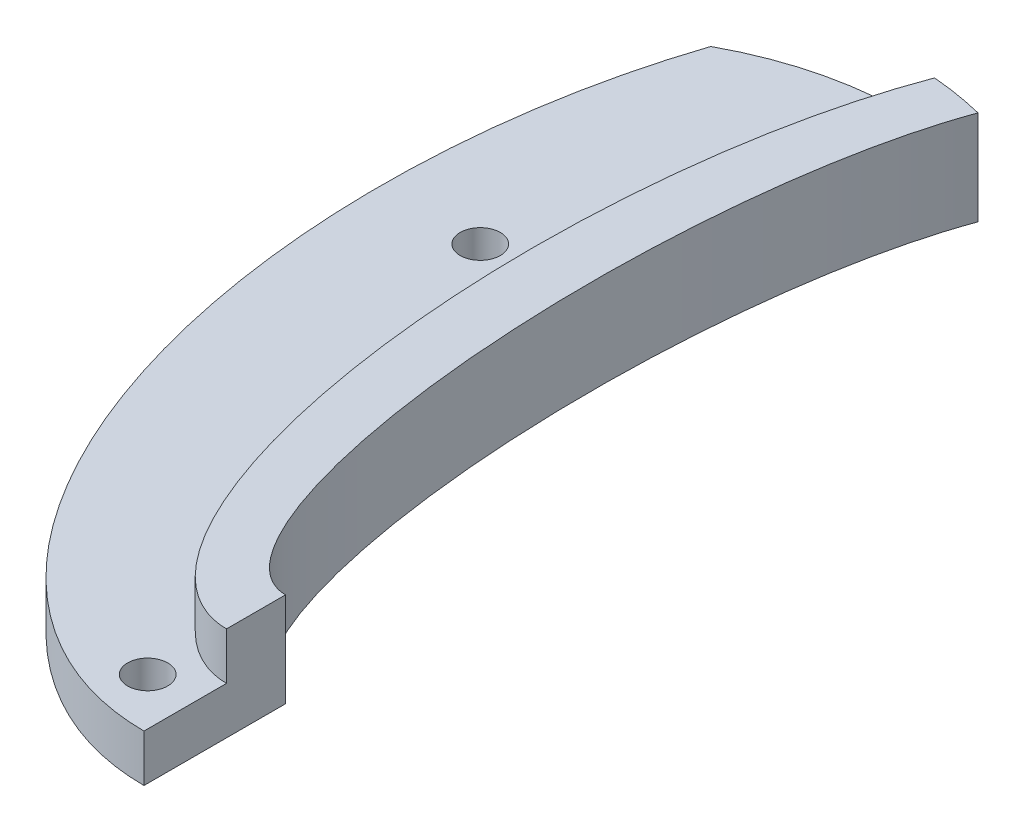
ISO-10303-21;
HEADER;
FILE_DESCRIPTION(('STEP AP214'),'2;1');
FILE_NAME('part.step','',(''),(''),'','','');
FILE_SCHEMA(('AUTOMOTIVE_DESIGN { 1 0 10303 214 1 1 1 1 }'));
ENDSEC;
DATA;
#1=APPLICATION_CONTEXT('core data for automotive mechanical design processes');
#2=APPLICATION_PROTOCOL_DEFINITION('international standard','automotive_design',2000,#1);
#3=PRODUCT_CONTEXT('',#1,'mechanical');
#4=PRODUCT('Part','Part','',(#3));
#5=PRODUCT_RELATED_PRODUCT_CATEGORY('part','',(#4));
#6=PRODUCT_DEFINITION_FORMATION('','',#4);
#7=PRODUCT_DEFINITION_CONTEXT('part definition',#1,'design');
#8=PRODUCT_DEFINITION('design','',#6,#7);
#9=PRODUCT_DEFINITION_SHAPE('','',#8);
#10=(LENGTH_UNIT() NAMED_UNIT(*) SI_UNIT(.MILLI.,.METRE.));
#11=(NAMED_UNIT(*) PLANE_ANGLE_UNIT() SI_UNIT($,.RADIAN.));
#12=(NAMED_UNIT(*) SI_UNIT($,.STERADIAN.) SOLID_ANGLE_UNIT());
#13=UNCERTAINTY_MEASURE_WITH_UNIT(LENGTH_MEASURE(1.E-05),#10,'distance_accuracy_value','');
#14=(GEOMETRIC_REPRESENTATION_CONTEXT(3) GLOBAL_UNCERTAINTY_ASSIGNED_CONTEXT((#13)) GLOBAL_UNIT_ASSIGNED_CONTEXT((#10,
#11,#12)) REPRESENTATION_CONTEXT('',''));
#15=CARTESIAN_POINT('',(0.,0.,0.));
#16=DIRECTION('',(0.,0.,1.));
#17=DIRECTION('',(1.,0.,0.));
#18=AXIS2_PLACEMENT_3D('',#15,#16,#17);
#19=CARTESIAN_POINT('',(0.,4.,0.));
#20=DIRECTION('',(0.,1.,0.));
#21=DIRECTION('',(0.,0.,1.));
#22=AXIS2_PLACEMENT_3D('',#19,#20,#21);
#23=PLANE('',#22);
#24=CARTESIAN_POINT('',(2.02962646689286E-13,4.,2.));
#25=DIRECTION('',(0.,1.,0.));
#26=DIRECTION('',(0.,0.,1.));
#27=AXIS2_PLACEMENT_3D('',#24,#25,#26);
#28=ELLIPSE('',#27,41.,14.9999999999998);
#29=CARTESIAN_POINT('',(-10.438251501384,4.,-27.4443448109796));
#30=VERTEX_POINT('',#29);
#31=CARTESIAN_POINT('',(0.,4.,43.));
#32=VERTEX_POINT('',#31);
#33=EDGE_CURVE('E53',#30,#32,#28,.T.);
#34=ORIENTED_EDGE('',*,*,#33,.F.);
#35=CARTESIAN_POINT('',(-12.7011018015187,4.,0.101324056613127));
#36=DIRECTION('',(0.,1.,0.));
#37=DIRECTION('',(0.,0.,1.));
#38=AXIS2_PLACEMENT_3D('',#35,#36,#37);
#39=CIRCLE('',#38,27.6384580764537);
#40=CARTESIAN_POINT('',(-10.0173486871435,4.,-27.4065263513153));
#41=VERTEX_POINT('',#40);
#42=EDGE_CURVE('E57',#41,#30,#39,.T.);
#43=ORIENTED_EDGE('',*,*,#42,.F.);
#44=CARTESIAN_POINT('',(0.,4.,0.));
#45=DIRECTION('',(0.,-1.,0.));
#46=DIRECTION('',(0.,0.,1.));
#47=AXIS2_PLACEMENT_3D('',#44,#45,#46);
#48=ELLIPSE('',#47,43.,13.);
#49=CARTESIAN_POINT('',(-10.000145873181,4.,-27.4751749778173));
#50=VERTEX_POINT('',#49);
#51=EDGE_CURVE('E162',#41,#50,#48,.T.);
#52=ORIENTED_EDGE('',*,*,#51,.T.);
#53=CARTESIAN_POINT('',(-13.,4.,4.50401092710764E-13));
#54=DIRECTION('',(0.,1.,0.));
#55=DIRECTION('',(0.,0.,1.));
#56=AXIS2_PLACEMENT_3D('',#53,#54,#55);
#57=CIRCLE('',#56,27.6384580764538);
#58=CARTESIAN_POINT('',(-26.2300133379316,4.,-24.2662545919642));
#59=VERTEX_POINT('',#58);
#60=EDGE_CURVE('E165',#50,#59,#57,.T.);
#61=ORIENTED_EDGE('',*,*,#60,.T.);
#62=CARTESIAN_POINT('',(0.,4.,0.));
#63=DIRECTION('',(0.,1.,0.));
#64=DIRECTION('',(0.,0.,1.));
#65=AXIS2_PLACEMENT_3D('',#62,#63,#64);
#66=ELLIPSE('',#65,50.,30.);
#67=CARTESIAN_POINT('',(0.,4.,50.));
#68=VERTEX_POINT('',#67);
#69=EDGE_CURVE('E167',#59,#68,#66,.T.);
#70=ORIENTED_EDGE('',*,*,#69,.T.);
#71=DIRECTION('',(0.,0.,-1.));
#72=VECTOR('',#71,1.);
#73=CARTESIAN_POINT('',(0.,4.,50.));
#74=LINE('',#73,#72);
#75=EDGE_CURVE('E166',#68,#32,#74,.T.);
#76=ORIENTED_EDGE('',*,*,#75,.T.);
#77=EDGE_LOOP('',(#34,#43,#52,#61,#70,#76));
#78=FACE_BOUND('',#77,.T.);
#79=CARTESIAN_POINT('',(-3.99729247475969,4.,45.6892620559413));
#80=DIRECTION('',(0.,1.,0.));
#81=DIRECTION('',(0.,0.,1.));
#82=AXIS2_PLACEMENT_3D('',#79,#80,#81);
#83=CIRCLE('',#82,1.7);
#84=CARTESIAN_POINT('',(-3.99729247475969,4.,47.3892620559413));
#85=VERTEX_POINT('',#84);
#86=EDGE_CURVE('E176',#85,#85,#83,.T.);
#87=ORIENTED_EDGE('',*,*,#86,.F.);
#88=EDGE_LOOP('',(#87));
#89=FACE_BOUND('',#88,.T.);
#90=CARTESIAN_POINT('',(-21.5,4.,4.81824424760352E-13));
#91=DIRECTION('',(0.,1.,0.));
#92=DIRECTION('',(0.,0.,1.));
#93=AXIS2_PLACEMENT_3D('',#90,#91,#92);
#94=CIRCLE('',#93,1.7);
#95=CARTESIAN_POINT('',(-21.5,4.,1.70000000000048));
#96=VERTEX_POINT('',#95);
#97=EDGE_CURVE('E217',#96,#96,#94,.T.);
#98=ORIENTED_EDGE('',*,*,#97,.F.);
#99=EDGE_LOOP('',(#98));
#100=FACE_BOUND('',#99,.T.);
#101=ADVANCED_FACE('F35',(#78,#89,#100),#23,.T.);
#102=CARTESIAN_POINT('',(0.,0.,0.));
#103=DIRECTION('',(0.,1.,0.));
#104=DIRECTION('',(0.,0.,1.));
#105=AXIS2_PLACEMENT_3D('',#102,#103,#104);
#106=PLANE('',#105);
#107=CARTESIAN_POINT('',(2.02962646689286E-13,0.,2.));
#108=DIRECTION('',(0.,-1.,0.));
#109=DIRECTION('',(0.,0.,1.));
#110=AXIS2_PLACEMENT_3D('',#107,#108,#109);
#111=ELLIPSE('',#110,36.,9.99999999999979);
#112=CARTESIAN_POINT('',(0.,0.,38.));
#113=VERTEX_POINT('',#112);
#114=CARTESIAN_POINT('',(-6.02957311771181,0.,-26.7198442599428));
#115=VERTEX_POINT('',#114);
#116=EDGE_CURVE('E128',#113,#115,#111,.T.);
#117=ORIENTED_EDGE('',*,*,#116,.F.);
#118=DIRECTION('',(0.,0.,-1.));
#119=VECTOR('',#118,1.);
#120=CARTESIAN_POINT('',(0.,0.,50.));
#121=LINE('',#120,#119);
#122=CARTESIAN_POINT('',(0.,0.,50.));
#123=VERTEX_POINT('',#122);
#124=EDGE_CURVE('E175',#123,#113,#121,.T.);
#125=ORIENTED_EDGE('',*,*,#124,.F.);
#126=CARTESIAN_POINT('',(0.,0.,0.));
#127=DIRECTION('',(0.,1.,0.));
#128=DIRECTION('',(0.,0.,1.));
#129=AXIS2_PLACEMENT_3D('',#126,#127,#128);
#130=ELLIPSE('',#129,50.,30.);
#131=CARTESIAN_POINT('',(-26.2300133379316,0.,-24.2662545919642));
#132=VERTEX_POINT('',#131);
#133=EDGE_CURVE('E172',#132,#123,#130,.T.);
#134=ORIENTED_EDGE('',*,*,#133,.F.);
#135=CARTESIAN_POINT('',(-13.,0.,4.50401092710764E-13));
#136=DIRECTION('',(0.,1.,0.));
#137=DIRECTION('',(0.,0.,1.));
#138=AXIS2_PLACEMENT_3D('',#135,#136,#137);
#139=CIRCLE('',#138,27.6384580764538);
#140=CARTESIAN_POINT('',(-10.000145873181,0.,-27.4751749778173));
#141=VERTEX_POINT('',#140);
#142=EDGE_CURVE('E180',#141,#132,#139,.T.);
#143=ORIENTED_EDGE('',*,*,#142,.F.);
#144=CARTESIAN_POINT('',(0.,0.,0.));
#145=DIRECTION('',(0.,-1.,0.));
#146=DIRECTION('',(0.,0.,1.));
#147=AXIS2_PLACEMENT_3D('',#144,#145,#146);
#148=ELLIPSE('',#147,43.,13.);
#149=CARTESIAN_POINT('',(-10.0173486871435,0.,-27.4065263513153));
#150=VERTEX_POINT('',#149);
#151=EDGE_CURVE('E178',#150,#141,#148,.T.);
#152=ORIENTED_EDGE('',*,*,#151,.F.);
#153=CARTESIAN_POINT('',(-12.7011018015187,0.,0.101324056613127));
#154=DIRECTION('',(0.,1.,0.));
#155=DIRECTION('',(0.,0.,1.));
#156=AXIS2_PLACEMENT_3D('',#153,#154,#155);
#157=CIRCLE('',#156,27.6384580764537);
#158=EDGE_CURVE('E109',#115,#150,#157,.T.);
#159=ORIENTED_EDGE('',*,*,#158,.F.);
#160=EDGE_LOOP('',(#117,#125,#134,#143,#152,#159));
#161=FACE_BOUND('',#160,.T.);
#162=CARTESIAN_POINT('',(-3.99729247475969,0.,45.6892620559413));
#163=DIRECTION('',(0.,1.,0.));
#164=DIRECTION('',(0.,0.,1.));
#165=AXIS2_PLACEMENT_3D('',#162,#163,#164);
#166=CIRCLE('',#165,1.7);
#167=CARTESIAN_POINT('',(-3.99729247475969,0.,47.3892620559413));
#168=VERTEX_POINT('',#167);
#169=EDGE_CURVE('E220',#168,#168,#166,.T.);
#170=ORIENTED_EDGE('',*,*,#169,.T.);
#171=EDGE_LOOP('',(#170));
#172=FACE_BOUND('',#171,.T.);
#173=CARTESIAN_POINT('',(-21.5,0.,4.81824424760352E-13));
#174=DIRECTION('',(0.,1.,0.));
#175=DIRECTION('',(0.,0.,1.));
#176=AXIS2_PLACEMENT_3D('',#173,#174,#175);
#177=CIRCLE('',#176,1.7);
#178=CARTESIAN_POINT('',(-21.5,0.,1.70000000000048));
#179=VERTEX_POINT('',#178);
#180=EDGE_CURVE('E214',#179,#179,#177,.T.);
#181=ORIENTED_EDGE('',*,*,#180,.T.);
#182=EDGE_LOOP('',(#181));
#183=FACE_BOUND('',#182,.T.);
#184=ADVANCED_FACE('F151',(#161,#172,#183),#106,.F.);
#185=DIRECTION('',(0.,-1.,0.));
#186=VECTOR('',#185,1.);
#187=SURFACE_OF_LINEAR_EXTRUSION('',#66,#186);
#188=ORIENTED_EDGE('',*,*,#133,.T.);
#189=DIRECTION('',(0.,-1.,0.));
#190=VECTOR('',#189,1.);
#191=CARTESIAN_POINT('',(0.,4.,50.));
#192=LINE('',#191,#190);
#193=EDGE_CURVE('E45',#68,#123,#192,.T.);
#194=ORIENTED_EDGE('',*,*,#193,.F.);
#195=ORIENTED_EDGE('',*,*,#69,.F.);
#196=DIRECTION('',(0.,-1.,0.));
#197=VECTOR('',#196,1.);
#198=CARTESIAN_POINT('',(-26.2300133379316,4.,-24.2662545919642));
#199=LINE('',#198,#197);
#200=EDGE_CURVE('E171',#59,#132,#199,.T.);
#201=ORIENTED_EDGE('',*,*,#200,.T.);
#202=EDGE_LOOP('',(#188,#194,#195,#201));
#203=FACE_BOUND('',#202,.T.);
#204=ADVANCED_FACE('F37',(#203),#187,.F.);
#205=CARTESIAN_POINT('',(0.,4.,50.));
#206=DIRECTION('',(-1.,0.,0.));
#207=DIRECTION('',(0.,0.,1.));
#208=AXIS2_PLACEMENT_3D('',#205,#206,#207);
#209=PLANE('',#208);
#210=ORIENTED_EDGE('',*,*,#124,.T.);
#211=DIRECTION('',(0.,1.,0.));
#212=VECTOR('',#211,1.);
#213=CARTESIAN_POINT('',(0.,0.,38.));
#214=LINE('',#213,#212);
#215=CARTESIAN_POINT('',(0.,8.,38.));
#216=VERTEX_POINT('',#215);
#217=EDGE_CURVE('E108',#113,#216,#214,.T.);
#218=ORIENTED_EDGE('',*,*,#217,.T.);
#219=DIRECTION('',(0.,0.,-1.));
#220=VECTOR('',#219,1.);
#221=CARTESIAN_POINT('',(0.,8.,38.));
#222=LINE('',#221,#220);
#223=CARTESIAN_POINT('',(0.,8.,43.));
#224=VERTEX_POINT('',#223);
#225=EDGE_CURVE('E112',#224,#216,#222,.T.);
#226=ORIENTED_EDGE('',*,*,#225,.F.);
#227=DIRECTION('',(0.,1.,0.));
#228=VECTOR('',#227,1.);
#229=CARTESIAN_POINT('',(0.,0.,43.));
#230=LINE('',#229,#228);
#231=EDGE_CURVE('E101',#32,#224,#230,.T.);
#232=ORIENTED_EDGE('',*,*,#231,.F.);
#233=ORIENTED_EDGE('',*,*,#75,.F.);
#234=ORIENTED_EDGE('',*,*,#193,.T.);
#235=EDGE_LOOP('',(#210,#218,#226,#232,#233,#234));
#236=FACE_BOUND('',#235,.T.);
#237=ADVANCED_FACE('F113',(#236),#209,.F.);
#238=DIRECTION('',(0.,-1.,0.));
#239=VECTOR('',#238,1.);
#240=SURFACE_OF_LINEAR_EXTRUSION('',#48,#239);
#241=ORIENTED_EDGE('',*,*,#51,.F.);
#242=DIRECTION('',(0.,-1.,0.));
#243=VECTOR('',#242,1.);
#244=CARTESIAN_POINT('',(-10.0173486871435,4.,-27.4065263513153));
#245=LINE('',#244,#243);
#246=EDGE_CURVE('E11',#41,#150,#245,.T.);
#247=ORIENTED_EDGE('',*,*,#246,.T.);
#248=ORIENTED_EDGE('',*,*,#151,.T.);
#249=DIRECTION('',(0.,-1.,0.));
#250=VECTOR('',#249,1.);
#251=CARTESIAN_POINT('',(-10.000145873181,4.,-27.4751749778173));
#252=LINE('',#251,#250);
#253=EDGE_CURVE('E184',#50,#141,#252,.T.);
#254=ORIENTED_EDGE('',*,*,#253,.F.);
#255=EDGE_LOOP('',(#241,#247,#248,#254));
#256=FACE_BOUND('',#255,.T.);
#257=ADVANCED_FACE('F157',(#256),#240,.F.);
#258=CARTESIAN_POINT('',(-13.,4.,4.50401092710764E-13));
#259=DIRECTION('',(0.,-1.,0.));
#260=DIRECTION('',(0.,0.,-1.));
#261=AXIS2_PLACEMENT_3D('',#258,#259,#260);
#262=CYLINDRICAL_SURFACE('',#261,27.6384580764538);
#263=ORIENTED_EDGE('',*,*,#142,.T.);
#264=ORIENTED_EDGE('',*,*,#200,.F.);
#265=ORIENTED_EDGE('',*,*,#60,.F.);
#266=ORIENTED_EDGE('',*,*,#253,.T.);
#267=EDGE_LOOP('',(#263,#264,#265,#266));
#268=FACE_BOUND('',#267,.T.);
#269=ADVANCED_FACE('F147',(#268),#262,.T.);
#270=CARTESIAN_POINT('',(-3.99729247475969,4.,45.6892620559413));
#271=DIRECTION('',(0.,-1.,0.));
#272=DIRECTION('',(0.,0.,-1.));
#273=AXIS2_PLACEMENT_3D('',#270,#271,#272);
#274=CYLINDRICAL_SURFACE('',#273,1.7);
#275=ORIENTED_EDGE('',*,*,#86,.T.);
#276=EDGE_LOOP('',(#275));
#277=FACE_BOUND('',#276,.T.);
#278=ORIENTED_EDGE('',*,*,#169,.F.);
#279=EDGE_LOOP('',(#278));
#280=FACE_BOUND('',#279,.T.);
#281=ADVANCED_FACE('F143',(#277,#280),#274,.F.);
#282=CARTESIAN_POINT('',(-21.5,4.,4.81824424760352E-13));
#283=DIRECTION('',(0.,-1.,0.));
#284=DIRECTION('',(0.,0.,-1.));
#285=AXIS2_PLACEMENT_3D('',#282,#283,#284);
#286=CYLINDRICAL_SURFACE('',#285,1.7);
#287=ORIENTED_EDGE('',*,*,#97,.T.);
#288=EDGE_LOOP('',(#287));
#289=FACE_BOUND('',#288,.T.);
#290=ORIENTED_EDGE('',*,*,#180,.F.);
#291=EDGE_LOOP('',(#290));
#292=FACE_BOUND('',#291,.T.);
#293=ADVANCED_FACE('F138',(#289,#292),#286,.F.);
#294=CARTESIAN_POINT('',(2.02962646689286E-13,0.,2.));
#295=DIRECTION('',(0.,1.,0.));
#296=DIRECTION('',(0.,0.,1.));
#297=AXIS2_PLACEMENT_3D('',#294,#295,#296);
#298=ELLIPSE('',#297,41.,14.9999999999998);
#299=DIRECTION('',(0.,1.,0.));
#300=VECTOR('',#299,1.);
#301=SURFACE_OF_LINEAR_EXTRUSION('',#298,#300);
#302=DIRECTION('',(0.,1.,0.));
#303=VECTOR('',#302,1.);
#304=CARTESIAN_POINT('',(-10.438251501384,0.,-27.4443448109796));
#305=LINE('',#304,#303);
#306=CARTESIAN_POINT('',(-10.438251501384,8.,-27.4443448109796));
#307=VERTEX_POINT('',#306);
#308=EDGE_CURVE('E207',#30,#307,#305,.T.);
#309=ORIENTED_EDGE('',*,*,#308,.F.);
#310=ORIENTED_EDGE('',*,*,#33,.T.);
#311=ORIENTED_EDGE('',*,*,#231,.T.);
#312=CARTESIAN_POINT('',(2.02962646689286E-13,8.,2.));
#313=DIRECTION('',(0.,1.,0.));
#314=DIRECTION('',(0.,0.,1.));
#315=AXIS2_PLACEMENT_3D('',#312,#313,#314);
#316=ELLIPSE('',#315,41.,14.9999999999998);
#317=EDGE_CURVE('E106',#307,#224,#316,.T.);
#318=ORIENTED_EDGE('',*,*,#317,.F.);
#319=EDGE_LOOP('',(#309,#310,#311,#318));
#320=FACE_BOUND('',#319,.T.);
#321=ADVANCED_FACE('F104',(#320),#301,.T.);
#322=CARTESIAN_POINT('',(-12.7011018015187,0.,0.101324056613127));
#323=DIRECTION('',(0.,1.,0.));
#324=DIRECTION('',(0.,0.,1.));
#325=AXIS2_PLACEMENT_3D('',#322,#323,#324);
#326=CYLINDRICAL_SURFACE('',#325,27.6384580764537);
#327=ORIENTED_EDGE('',*,*,#246,.F.);
#328=ORIENTED_EDGE('',*,*,#42,.T.);
#329=ORIENTED_EDGE('',*,*,#308,.T.);
#330=CARTESIAN_POINT('',(-12.7011018015187,8.,0.101324056613127));
#331=DIRECTION('',(0.,1.,0.));
#332=DIRECTION('',(0.,0.,1.));
#333=AXIS2_PLACEMENT_3D('',#330,#331,#332);
#334=CIRCLE('',#333,27.6384580764537);
#335=CARTESIAN_POINT('',(-6.02957311771181,8.,-26.7198442599428));
#336=VERTEX_POINT('',#335);
#337=EDGE_CURVE('E123',#336,#307,#334,.T.);
#338=ORIENTED_EDGE('',*,*,#337,.F.);
#339=DIRECTION('',(0.,1.,0.));
#340=VECTOR('',#339,1.);
#341=CARTESIAN_POINT('',(-6.02957311771181,0.,-26.7198442599428));
#342=LINE('',#341,#340);
#343=EDGE_CURVE('E200',#115,#336,#342,.T.);
#344=ORIENTED_EDGE('',*,*,#343,.F.);
#345=ORIENTED_EDGE('',*,*,#158,.T.);
#346=EDGE_LOOP('',(#327,#328,#329,#338,#344,#345));
#347=FACE_BOUND('',#346,.T.);
#348=ADVANCED_FACE('F137',(#347),#326,.T.);
#349=DIRECTION('',(0.,1.,0.));
#350=VECTOR('',#349,1.);
#351=SURFACE_OF_LINEAR_EXTRUSION('',#111,#350);
#352=ORIENTED_EDGE('',*,*,#343,.T.);
#353=CARTESIAN_POINT('',(2.02962646689286E-13,8.,2.));
#354=DIRECTION('',(0.,-1.,0.));
#355=DIRECTION('',(0.,0.,1.));
#356=AXIS2_PLACEMENT_3D('',#353,#354,#355);
#357=ELLIPSE('',#356,36.,9.99999999999979);
#358=EDGE_CURVE('E118',#216,#336,#357,.T.);
#359=ORIENTED_EDGE('',*,*,#358,.F.);
#360=ORIENTED_EDGE('',*,*,#217,.F.);
#361=ORIENTED_EDGE('',*,*,#116,.T.);
#362=EDGE_LOOP('',(#352,#359,#360,#361));
#363=FACE_BOUND('',#362,.T.);
#364=ADVANCED_FACE('F139',(#363),#351,.T.);
#365=CARTESIAN_POINT('',(2.02962646689286E-13,8.,2.));
#366=DIRECTION('',(0.,1.,0.));
#367=DIRECTION('',(0.,0.,1.));
#368=AXIS2_PLACEMENT_3D('',#365,#366,#367);
#369=PLANE('',#368);
#370=ORIENTED_EDGE('',*,*,#317,.T.);
#371=ORIENTED_EDGE('',*,*,#225,.T.);
#372=ORIENTED_EDGE('',*,*,#358,.T.);
#373=ORIENTED_EDGE('',*,*,#337,.T.);
#374=EDGE_LOOP('',(#370,#371,#372,#373));
#375=FACE_BOUND('',#374,.T.);
#376=ADVANCED_FACE('F121',(#375),#369,.T.);
#377=CLOSED_SHELL('',(#101,#184,#204,#237,#257,#269,#281,#293,#321,#348,#364,#376));
#378=MANIFOLD_SOLID_BREP('B2',#377);
#379=ADVANCED_BREP_SHAPE_REPRESENTATION('',(#18,#378),#14);
#380=SHAPE_DEFINITION_REPRESENTATION(#9,#379);
ENDSEC;
END-ISO-10303-21;
